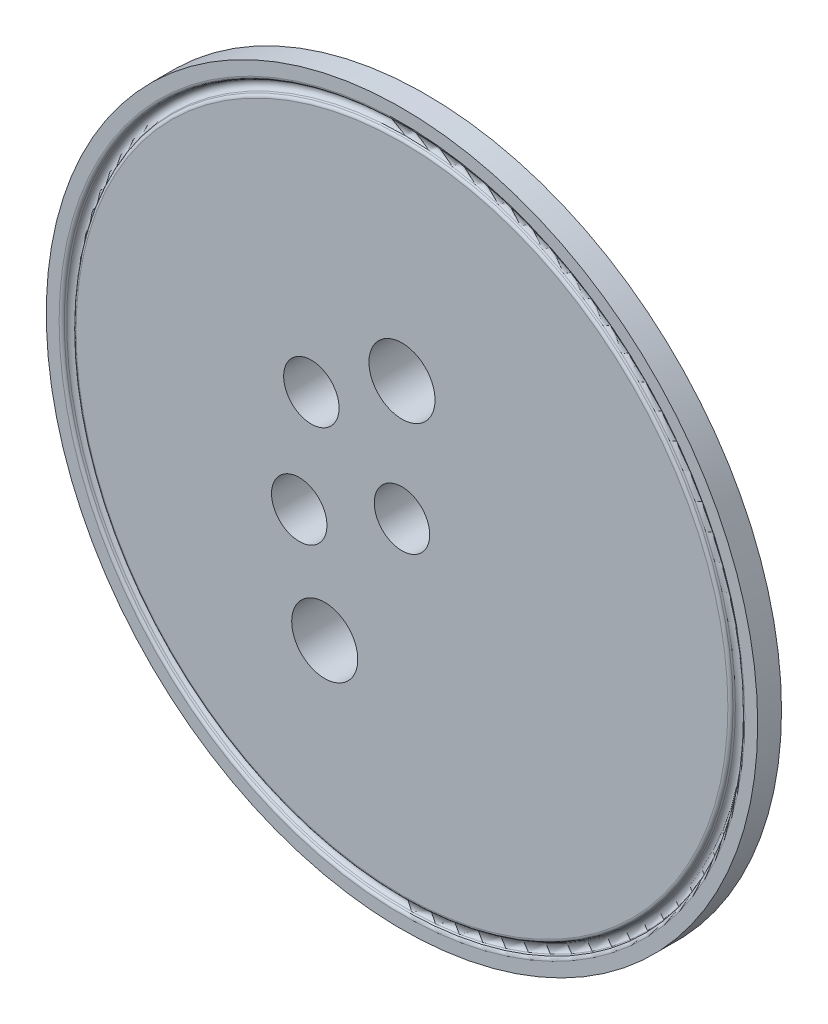
ISO-10303-21;
HEADER;
FILE_DESCRIPTION(('STEP AP214'),'2;1');
FILE_NAME('part.step','',(''),(''),'','','');
FILE_SCHEMA(('AUTOMOTIVE_DESIGN { 1 0 10303 214 1 1 1 1 }'));
ENDSEC;
DATA;
#1=APPLICATION_CONTEXT('core data for automotive mechanical design processes');
#2=APPLICATION_PROTOCOL_DEFINITION('international standard','automotive_design',2000,#1);
#3=PRODUCT_CONTEXT('',#1,'mechanical');
#4=PRODUCT('Part','Part','',(#3));
#5=PRODUCT_RELATED_PRODUCT_CATEGORY('part','',(#4));
#6=PRODUCT_DEFINITION_FORMATION('','',#4);
#7=PRODUCT_DEFINITION_CONTEXT('part definition',#1,'design');
#8=PRODUCT_DEFINITION('design','',#6,#7);
#9=PRODUCT_DEFINITION_SHAPE('','',#8);
#10=(LENGTH_UNIT() NAMED_UNIT(*) SI_UNIT(.MILLI.,.METRE.));
#11=(NAMED_UNIT(*) PLANE_ANGLE_UNIT() SI_UNIT($,.RADIAN.));
#12=(NAMED_UNIT(*) SI_UNIT($,.STERADIAN.) SOLID_ANGLE_UNIT());
#13=UNCERTAINTY_MEASURE_WITH_UNIT(LENGTH_MEASURE(1.E-05),#10,'distance_accuracy_value','');
#14=(GEOMETRIC_REPRESENTATION_CONTEXT(3) GLOBAL_UNCERTAINTY_ASSIGNED_CONTEXT((#13)) GLOBAL_UNIT_ASSIGNED_CONTEXT((#10,
#11,#12)) REPRESENTATION_CONTEXT('',''));
#15=CARTESIAN_POINT('',(0.,0.,0.));
#16=DIRECTION('',(0.,0.,1.));
#17=DIRECTION('',(1.,0.,0.));
#18=AXIS2_PLACEMENT_3D('',#15,#16,#17);
#19=CARTESIAN_POINT('',(0.,68.2954539594501,-11.0998));
#20=DIRECTION('',(0.,0.,1.));
#21=DIRECTION('',(1.,0.,0.));
#22=AXIS2_PLACEMENT_3D('',#19,#20,#21);
#23=PLANE('',#22);
#24=CARTESIAN_POINT('',(0.,27.9765569002959,-11.0998));
#25=DIRECTION('',(0.,0.,-1.));
#26=DIRECTION('',(-1.,0.,0.));
#27=AXIS2_PLACEMENT_3D('',#24,#25,#26);
#28=CIRCLE('',#27,7.75);
#29=CARTESIAN_POINT('',(-7.75,27.9765569002959,-11.0998));
#30=VERTEX_POINT('',#29);
#31=EDGE_CURVE('E94',#30,#30,#28,.T.);
#32=ORIENTED_EDGE('',*,*,#31,.F.);
#33=EDGE_LOOP('',(#32));
#34=FACE_BOUND('',#33,.T.);
#35=CARTESIAN_POINT('',(-24.0989998366618,-10.1575926899967,-11.0998));
#36=DIRECTION('',(0.,0.,-1.));
#37=DIRECTION('',(-1.,0.,0.));
#38=AXIS2_PLACEMENT_3D('',#35,#36,#37);
#39=CIRCLE('',#38,6.5);
#40=CARTESIAN_POINT('',(-30.5989998366618,-10.1575926899967,-11.0998));
#41=VERTEX_POINT('',#40);
#42=EDGE_CURVE('E119',#41,#41,#39,.T.);
#43=ORIENTED_EDGE('',*,*,#42,.F.);
#44=EDGE_LOOP('',(#43));
#45=FACE_BOUND('',#44,.T.);
#46=CARTESIAN_POINT('',(-21.2593740592087,15.1001313305069,-11.0998));
#47=DIRECTION('',(0.,0.,-1.));
#48=DIRECTION('',(-1.,0.,0.));
#49=AXIS2_PLACEMENT_3D('',#46,#47,#48);
#50=CIRCLE('',#49,6.5);
#51=CARTESIAN_POINT('',(-27.7593740592087,15.1001313305069,-11.0998));
#52=VERTEX_POINT('',#51);
#53=EDGE_CURVE('E126',#52,#52,#50,.T.);
#54=ORIENTED_EDGE('',*,*,#53,.F.);
#55=EDGE_LOOP('',(#54));
#56=FACE_BOUND('',#55,.T.);
#57=CARTESIAN_POINT('',(-18.1208403051817,-33.7713228393432,-11.0998));
#58=DIRECTION('',(0.,0.,-1.));
#59=DIRECTION('',(-1.,0.,0.));
#60=AXIS2_PLACEMENT_3D('',#57,#58,#59);
#61=CIRCLE('',#60,7.75);
#62=CARTESIAN_POINT('',(-25.8708403051817,-33.7713228393432,-11.0998));
#63=VERTEX_POINT('',#62);
#64=EDGE_CURVE('E101',#63,#63,#61,.T.);
#65=ORIENTED_EDGE('',*,*,#64,.F.);
#66=EDGE_LOOP('',(#65));
#67=FACE_BOUND('',#66,.T.);
#68=CARTESIAN_POINT('',(0.,0.,-11.0998));
#69=DIRECTION('',(0.,0.,-1.));
#70=DIRECTION('',(-1.,0.,0.));
#71=AXIS2_PLACEMENT_3D('',#68,#69,#70);
#72=CIRCLE('',#71,6.5);
#73=CARTESIAN_POINT('',(-6.5,0.,-11.0998));
#74=VERTEX_POINT('',#73);
#75=EDGE_CURVE('E89',#74,#74,#72,.T.);
#76=ORIENTED_EDGE('',*,*,#75,.F.);
#77=EDGE_LOOP('',(#76));
#78=FACE_BOUND('',#77,.T.);
#79=CARTESIAN_POINT('',(0.,0.,-11.0998));
#80=DIRECTION('',(0.,0.,1.));
#81=DIRECTION('',(1.,0.,0.));
#82=AXIS2_PLACEMENT_3D('',#79,#80,#81);
#83=CIRCLE('',#82,68.2954539594501);
#84=CARTESIAN_POINT('',(68.2954539594501,0.,-11.0998));
#85=VERTEX_POINT('',#84);
#86=EDGE_CURVE('E11',#85,#85,#83,.T.);
#87=ORIENTED_EDGE('',*,*,#86,.F.);
#88=EDGE_LOOP('',(#87));
#89=FACE_BOUND('',#88,.T.);
#90=ADVANCED_FACE('F44',(#34,#45,#56,#67,#78,#89),#23,.F.);
#91=CARTESIAN_POINT('',(0.,0.,-11.0998));
#92=DIRECTION('',(0.,0.,1.));
#93=DIRECTION('',(1.,0.,0.));
#94=AXIS2_PLACEMENT_3D('',#91,#92,#93);
#95=CONICAL_SURFACE('',#94,68.2954539594501,1.22173047639603);
#96=CARTESIAN_POINT('',(0.,0.,-5.588));
#97=DIRECTION('',(0.,0.,1.));
#98=DIRECTION('',(1.,0.,0.));
#99=AXIS2_PLACEMENT_3D('',#96,#97,#98);
#100=CIRCLE('',#99,83.439);
#101=CARTESIAN_POINT('',(83.439,0.,-5.588));
#102=VERTEX_POINT('',#101);
#103=EDGE_CURVE('E52',#102,#102,#100,.T.);
#104=ORIENTED_EDGE('',*,*,#103,.F.);
#105=EDGE_LOOP('',(#104));
#106=FACE_BOUND('',#105,.T.);
#107=ORIENTED_EDGE('',*,*,#86,.T.);
#108=EDGE_LOOP('',(#107));
#109=FACE_BOUND('',#108,.T.);
#110=ADVANCED_FACE('F157',(#106,#109),#95,.T.);
#111=CARTESIAN_POINT('',(0.,0.,0.));
#112=DIRECTION('',(0.,0.,1.));
#113=DIRECTION('',(1.,0.,0.));
#114=AXIS2_PLACEMENT_3D('',#111,#112,#113);
#115=CYLINDRICAL_SURFACE('',#114,83.439);
#116=CARTESIAN_POINT('',(0.,0.,0.));
#117=DIRECTION('',(0.,0.,1.));
#118=DIRECTION('',(1.,0.,0.));
#119=AXIS2_PLACEMENT_3D('',#116,#117,#118);
#120=CIRCLE('',#119,83.439);
#121=CARTESIAN_POINT('',(83.439,0.,0.));
#122=VERTEX_POINT('',#121);
#123=EDGE_CURVE('E57',#122,#122,#120,.T.);
#124=ORIENTED_EDGE('',*,*,#123,.F.);
#125=EDGE_LOOP('',(#124));
#126=FACE_BOUND('',#125,.T.);
#127=ORIENTED_EDGE('',*,*,#103,.T.);
#128=EDGE_LOOP('',(#127));
#129=FACE_BOUND('',#128,.T.);
#130=ADVANCED_FACE('F164',(#126,#129),#115,.T.);
#131=CARTESIAN_POINT('',(0.,80.4257722747395,0.));
#132=DIRECTION('',(0.,0.,-1.));
#133=DIRECTION('',(-1.,0.,0.));
#134=AXIS2_PLACEMENT_3D('',#131,#132,#133);
#135=PLANE('',#134);
#136=CARTESIAN_POINT('',(0.,0.,0.));
#137=DIRECTION('',(0.,0.,1.));
#138=DIRECTION('',(1.,0.,0.));
#139=AXIS2_PLACEMENT_3D('',#136,#137,#138);
#140=CIRCLE('',#139,80.4257722747395);
#141=CARTESIAN_POINT('',(80.4257722747395,0.,0.));
#142=VERTEX_POINT('',#141);
#143=EDGE_CURVE('E62',#142,#142,#140,.T.);
#144=ORIENTED_EDGE('',*,*,#143,.F.);
#145=EDGE_LOOP('',(#144));
#146=FACE_BOUND('',#145,.T.);
#147=ORIENTED_EDGE('',*,*,#123,.T.);
#148=EDGE_LOOP('',(#147));
#149=FACE_BOUND('',#148,.T.);
#150=ADVANCED_FACE('F206',(#146,#149),#135,.F.);
#151=CARTESIAN_POINT('',(0.,0.,-0.7874));
#152=DIRECTION('',(0.,0.,1.));
#153=DIRECTION('',(1.,0.,0.));
#154=AXIS2_PLACEMENT_3D('',#151,#152,#153);
#155=TOROIDAL_SURFACE('',#154,80.4257722747395,0.787400000000004);
#156=CARTESIAN_POINT('',(0.,0.,-0.479738309427544));
#157=DIRECTION('',(0.,0.,1.));
#158=DIRECTION('',(1.,0.,0.));
#159=AXIS2_PLACEMENT_3D('',#156,#157,#158);
#160=CIRCLE('',#159,79.700966753131);
#161=CARTESIAN_POINT('',(79.700966753131,0.,-0.479738309427544));
#162=VERTEX_POINT('',#161);
#163=EDGE_CURVE('E68',#162,#162,#160,.T.);
#164=ORIENTED_EDGE('',*,*,#163,.F.);
#165=EDGE_LOOP('',(#164));
#166=FACE_BOUND('',#165,.T.);
#167=ORIENTED_EDGE('',*,*,#143,.T.);
#168=EDGE_LOOP('',(#167));
#169=FACE_BOUND('',#168,.T.);
#170=ADVANCED_FACE('F202',(#166,#169),#155,.T.);
#171=CARTESIAN_POINT('',(0.,0.,-0.479738309427544));
#172=DIRECTION('',(0.,0.,1.));
#173=DIRECTION('',(1.,0.,0.));
#174=AXIS2_PLACEMENT_3D('',#171,#172,#173);
#175=CONICAL_SURFACE('',#174,79.700966753131,0.40142572795866);
#176=CARTESIAN_POINT('',(0.,0.,-0.872854821190487));
#177=DIRECTION('',(0.,0.,1.));
#178=DIRECTION('',(1.,0.,0.));
#179=AXIS2_PLACEMENT_3D('',#176,#177,#178);
#180=CIRCLE('',#179,79.5340986940515);
#181=CARTESIAN_POINT('',(79.5340986940515,0.,-0.872854821190487));
#182=VERTEX_POINT('',#181);
#183=EDGE_CURVE('E72',#182,#182,#180,.T.);
#184=ORIENTED_EDGE('',*,*,#183,.F.);
#185=EDGE_LOOP('',(#184));
#186=FACE_BOUND('',#185,.T.);
#187=ORIENTED_EDGE('',*,*,#163,.T.);
#188=EDGE_LOOP('',(#187));
#189=FACE_BOUND('',#188,.T.);
#190=ADVANCED_FACE('F198',(#186,#189),#175,.F.);
#191=CARTESIAN_POINT('',(0.,0.,-0.4064));
#192=DIRECTION('',(0.,0.,1.));
#193=DIRECTION('',(1.,0.,0.));
#194=AXIS2_PLACEMENT_3D('',#191,#192,#193);
#195=TOROIDAL_SURFACE('',#194,78.4352,1.1938);
#196=CARTESIAN_POINT('',(0.,0.,-0.872854821190497));
#197=DIRECTION('',(0.,0.,1.));
#198=DIRECTION('',(1.,0.,0.));
#199=AXIS2_PLACEMENT_3D('',#196,#197,#198);
#200=CIRCLE('',#199,77.3363013059485);
#201=CARTESIAN_POINT('',(77.3363013059485,0.,-0.872854821190497));
#202=VERTEX_POINT('',#201);
#203=EDGE_CURVE('E76',#202,#202,#200,.T.);
#204=ORIENTED_EDGE('',*,*,#203,.F.);
#205=EDGE_LOOP('',(#204));
#206=FACE_BOUND('',#205,.T.);
#207=ORIENTED_EDGE('',*,*,#183,.T.);
#208=EDGE_LOOP('',(#207));
#209=FACE_BOUND('',#208,.T.);
#210=ADVANCED_FACE('F194',(#206,#209),#195,.F.);
#211=CARTESIAN_POINT('',(0.,0.,-0.872854821190497));
#212=DIRECTION('',(0.,0.,-1.));
#213=DIRECTION('',(-1.,0.,0.));
#214=AXIS2_PLACEMENT_3D('',#211,#212,#213);
#215=CONICAL_SURFACE('',#214,77.3363013059485,0.401425727958679);
#216=CARTESIAN_POINT('',(0.,0.,-0.479738309427542));
#217=DIRECTION('',(0.,0.,1.));
#218=DIRECTION('',(1.,0.,0.));
#219=AXIS2_PLACEMENT_3D('',#216,#217,#218);
#220=CIRCLE('',#219,77.1694332468689);
#221=CARTESIAN_POINT('',(77.1694332468689,0.,-0.479738309427542));
#222=VERTEX_POINT('',#221);
#223=EDGE_CURVE('E80',#222,#222,#220,.T.);
#224=ORIENTED_EDGE('',*,*,#223,.F.);
#225=EDGE_LOOP('',(#224));
#226=FACE_BOUND('',#225,.T.);
#227=ORIENTED_EDGE('',*,*,#203,.T.);
#228=EDGE_LOOP('',(#227));
#229=FACE_BOUND('',#228,.T.);
#230=ADVANCED_FACE('F190',(#226,#229),#215,.T.);
#231=CARTESIAN_POINT('',(0.,0.,-0.7874));
#232=DIRECTION('',(0.,0.,1.));
#233=DIRECTION('',(1.,0.,0.));
#234=AXIS2_PLACEMENT_3D('',#231,#232,#233);
#235=TOROIDAL_SURFACE('',#234,76.4446277252605,0.787399999999998);
#236=CARTESIAN_POINT('',(0.,0.,0.));
#237=DIRECTION('',(0.,0.,1.));
#238=DIRECTION('',(1.,0.,0.));
#239=AXIS2_PLACEMENT_3D('',#236,#237,#238);
#240=CIRCLE('',#239,76.4446277252605);
#241=CARTESIAN_POINT('',(76.4446277252605,0.,0.));
#242=VERTEX_POINT('',#241);
#243=EDGE_CURVE('E84',#242,#242,#240,.T.);
#244=ORIENTED_EDGE('',*,*,#243,.F.);
#245=EDGE_LOOP('',(#244));
#246=FACE_BOUND('',#245,.T.);
#247=ORIENTED_EDGE('',*,*,#223,.T.);
#248=EDGE_LOOP('',(#247));
#249=FACE_BOUND('',#248,.T.);
#250=ADVANCED_FACE('F182',(#246,#249),#235,.T.);
#251=CARTESIAN_POINT('',(0.,0.,0.));
#252=DIRECTION('',(0.,0.,-1.));
#253=DIRECTION('',(-1.,0.,0.));
#254=AXIS2_PLACEMENT_3D('',#251,#252,#253);
#255=PLANE('',#254);
#256=CARTESIAN_POINT('',(0.,27.9765569002959,0.));
#257=DIRECTION('',(0.,0.,-1.));
#258=DIRECTION('',(-1.,0.,0.));
#259=AXIS2_PLACEMENT_3D('',#256,#257,#258);
#260=CIRCLE('',#259,7.75);
#261=CARTESIAN_POINT('',(-7.75,27.9765569002959,0.));
#262=VERTEX_POINT('',#261);
#263=EDGE_CURVE('E116',#262,#262,#260,.T.);
#264=ORIENTED_EDGE('',*,*,#263,.T.);
#265=EDGE_LOOP('',(#264));
#266=FACE_BOUND('',#265,.T.);
#267=CARTESIAN_POINT('',(-24.0989998366618,-10.1575926899967,0.));
#268=DIRECTION('',(0.,0.,-1.));
#269=DIRECTION('',(-1.,0.,0.));
#270=AXIS2_PLACEMENT_3D('',#267,#268,#269);
#271=CIRCLE('',#270,6.5);
#272=CARTESIAN_POINT('',(-30.5989998366618,-10.1575926899967,0.));
#273=VERTEX_POINT('',#272);
#274=EDGE_CURVE('E123',#273,#273,#271,.T.);
#275=ORIENTED_EDGE('',*,*,#274,.T.);
#276=EDGE_LOOP('',(#275));
#277=FACE_BOUND('',#276,.T.);
#278=CARTESIAN_POINT('',(-21.2593740592087,15.1001313305069,0.));
#279=DIRECTION('',(0.,0.,-1.));
#280=DIRECTION('',(-1.,0.,0.));
#281=AXIS2_PLACEMENT_3D('',#278,#279,#280);
#282=CIRCLE('',#281,6.5);
#283=CARTESIAN_POINT('',(-27.7593740592087,15.1001313305069,0.));
#284=VERTEX_POINT('',#283);
#285=EDGE_CURVE('E107',#284,#284,#282,.T.);
#286=ORIENTED_EDGE('',*,*,#285,.T.);
#287=EDGE_LOOP('',(#286));
#288=FACE_BOUND('',#287,.T.);
#289=CARTESIAN_POINT('',(-18.1208403051817,-33.7713228393432,0.));
#290=DIRECTION('',(0.,0.,-1.));
#291=DIRECTION('',(-1.,0.,0.));
#292=AXIS2_PLACEMENT_3D('',#289,#290,#291);
#293=CIRCLE('',#292,7.75);
#294=CARTESIAN_POINT('',(-25.8708403051817,-33.7713228393432,0.));
#295=VERTEX_POINT('',#294);
#296=EDGE_CURVE('E108',#295,#295,#293,.T.);
#297=ORIENTED_EDGE('',*,*,#296,.T.);
#298=EDGE_LOOP('',(#297));
#299=FACE_BOUND('',#298,.T.);
#300=CARTESIAN_POINT('',(0.,0.,0.));
#301=DIRECTION('',(0.,0.,-1.));
#302=DIRECTION('',(-1.,0.,0.));
#303=AXIS2_PLACEMENT_3D('',#300,#301,#302);
#304=CIRCLE('',#303,6.5);
#305=CARTESIAN_POINT('',(-6.5,0.,0.));
#306=VERTEX_POINT('',#305);
#307=EDGE_CURVE('E88',#306,#306,#304,.T.);
#308=ORIENTED_EDGE('',*,*,#307,.T.);
#309=EDGE_LOOP('',(#308));
#310=FACE_BOUND('',#309,.T.);
#311=ORIENTED_EDGE('',*,*,#243,.T.);
#312=EDGE_LOOP('',(#311));
#313=FACE_BOUND('',#312,.T.);
#314=ADVANCED_FACE('F138',(#266,#277,#288,#299,#310,#313),#255,.F.);
#315=CARTESIAN_POINT('',(0.,0.,0.));
#316=DIRECTION('',(0.,0.,-1.));
#317=DIRECTION('',(-1.,0.,0.));
#318=AXIS2_PLACEMENT_3D('',#315,#316,#317);
#319=CYLINDRICAL_SURFACE('',#318,6.5);
#320=ORIENTED_EDGE('',*,*,#307,.F.);
#321=EDGE_LOOP('',(#320));
#322=FACE_BOUND('',#321,.T.);
#323=ORIENTED_EDGE('',*,*,#75,.T.);
#324=EDGE_LOOP('',(#323));
#325=FACE_BOUND('',#324,.T.);
#326=ADVANCED_FACE('F153',(#322,#325),#319,.F.);
#327=CARTESIAN_POINT('',(-18.1208403051817,-33.7713228393432,0.));
#328=DIRECTION('',(0.,0.,-1.));
#329=DIRECTION('',(-1.,0.,0.));
#330=AXIS2_PLACEMENT_3D('',#327,#328,#329);
#331=CYLINDRICAL_SURFACE('',#330,7.75);
#332=ORIENTED_EDGE('',*,*,#296,.F.);
#333=EDGE_LOOP('',(#332));
#334=FACE_BOUND('',#333,.T.);
#335=ORIENTED_EDGE('',*,*,#64,.T.);
#336=EDGE_LOOP('',(#335));
#337=FACE_BOUND('',#336,.T.);
#338=ADVANCED_FACE('F144',(#334,#337),#331,.F.);
#339=CARTESIAN_POINT('',(-21.2593740592087,15.1001313305069,0.));
#340=DIRECTION('',(0.,0.,-1.));
#341=DIRECTION('',(-1.,0.,0.));
#342=AXIS2_PLACEMENT_3D('',#339,#340,#341);
#343=CYLINDRICAL_SURFACE('',#342,6.5);
#344=ORIENTED_EDGE('',*,*,#285,.F.);
#345=EDGE_LOOP('',(#344));
#346=FACE_BOUND('',#345,.T.);
#347=ORIENTED_EDGE('',*,*,#53,.T.);
#348=EDGE_LOOP('',(#347));
#349=FACE_BOUND('',#348,.T.);
#350=ADVANCED_FACE('F141',(#346,#349),#343,.F.);
#351=CARTESIAN_POINT('',(-24.0989998366618,-10.1575926899967,0.));
#352=DIRECTION('',(0.,0.,-1.));
#353=DIRECTION('',(-1.,0.,0.));
#354=AXIS2_PLACEMENT_3D('',#351,#352,#353);
#355=CYLINDRICAL_SURFACE('',#354,6.5);
#356=ORIENTED_EDGE('',*,*,#274,.F.);
#357=EDGE_LOOP('',(#356));
#358=FACE_BOUND('',#357,.T.);
#359=ORIENTED_EDGE('',*,*,#42,.T.);
#360=EDGE_LOOP('',(#359));
#361=FACE_BOUND('',#360,.T.);
#362=ADVANCED_FACE('F143',(#358,#361),#355,.F.);
#363=CARTESIAN_POINT('',(0.,27.9765569002959,0.));
#364=DIRECTION('',(0.,0.,-1.));
#365=DIRECTION('',(-1.,0.,0.));
#366=AXIS2_PLACEMENT_3D('',#363,#364,#365);
#367=CYLINDRICAL_SURFACE('',#366,7.75);
#368=ORIENTED_EDGE('',*,*,#263,.F.);
#369=EDGE_LOOP('',(#368));
#370=FACE_BOUND('',#369,.T.);
#371=ORIENTED_EDGE('',*,*,#31,.T.);
#372=EDGE_LOOP('',(#371));
#373=FACE_BOUND('',#372,.T.);
#374=ADVANCED_FACE('F150',(#370,#373),#367,.F.);
#375=CLOSED_SHELL('',(#90,#110,#130,#150,#170,#190,#210,#230,#250,#314,#326,#338,#350,#362,#374));
#376=MANIFOLD_SOLID_BREP('B2',#375);
#377=ADVANCED_BREP_SHAPE_REPRESENTATION('',(#18,#376),#14);
#378=SHAPE_DEFINITION_REPRESENTATION(#9,#377);
ENDSEC;
END-ISO-10303-21;
